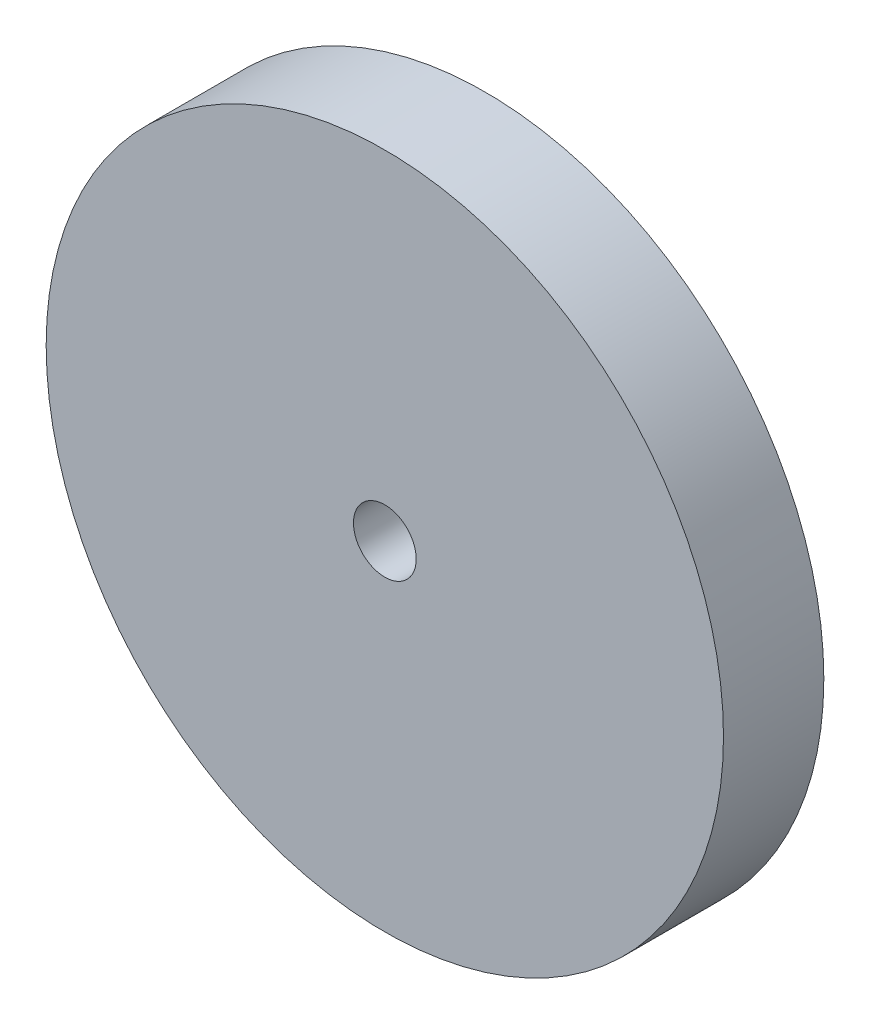
ISO-10303-21;
HEADER;
FILE_DESCRIPTION(('STEP AP214'),'2;1');
FILE_NAME('part.step','',(''),(''),'','','');
FILE_SCHEMA(('AUTOMOTIVE_DESIGN { 1 0 10303 214 1 1 1 1 }'));
ENDSEC;
DATA;
#1=APPLICATION_CONTEXT('core data for automotive mechanical design processes');
#2=APPLICATION_PROTOCOL_DEFINITION('international standard','automotive_design',2000,#1);
#3=PRODUCT_CONTEXT('',#1,'mechanical');
#4=PRODUCT('Part','Part','',(#3));
#5=PRODUCT_RELATED_PRODUCT_CATEGORY('part','',(#4));
#6=PRODUCT_DEFINITION_FORMATION('','',#4);
#7=PRODUCT_DEFINITION_CONTEXT('part definition',#1,'design');
#8=PRODUCT_DEFINITION('design','',#6,#7);
#9=PRODUCT_DEFINITION_SHAPE('','',#8);
#10=(LENGTH_UNIT() NAMED_UNIT(*) SI_UNIT(.MILLI.,.METRE.));
#11=(NAMED_UNIT(*) PLANE_ANGLE_UNIT() SI_UNIT($,.RADIAN.));
#12=(NAMED_UNIT(*) SI_UNIT($,.STERADIAN.) SOLID_ANGLE_UNIT());
#13=UNCERTAINTY_MEASURE_WITH_UNIT(LENGTH_MEASURE(1.E-05),#10,'distance_accuracy_value','');
#14=(GEOMETRIC_REPRESENTATION_CONTEXT(3) GLOBAL_UNCERTAINTY_ASSIGNED_CONTEXT((#13)) GLOBAL_UNIT_ASSIGNED_CONTEXT((#10,
#11,#12)) REPRESENTATION_CONTEXT('',''));
#15=CARTESIAN_POINT('',(0.,0.,0.));
#16=DIRECTION('',(0.,0.,1.));
#17=DIRECTION('',(1.,0.,0.));
#18=AXIS2_PLACEMENT_3D('',#15,#16,#17);
#19=CARTESIAN_POINT('',(0.,0.,8.));
#20=DIRECTION('',(0.,0.,1.));
#21=DIRECTION('',(1.,0.,0.));
#22=AXIS2_PLACEMENT_3D('',#19,#20,#21);
#23=PLANE('',#22);
#24=CARTESIAN_POINT('',(0.,0.,8.));
#25=DIRECTION('',(0.,0.,1.));
#26=DIRECTION('',(1.,0.,0.));
#27=AXIS2_PLACEMENT_3D('',#24,#25,#26);
#28=CIRCLE('',#27,27.);
#29=CARTESIAN_POINT('',(27.,0.,8.));
#30=VERTEX_POINT('',#29);
#31=EDGE_CURVE('E10',#30,#30,#28,.T.);
#32=ORIENTED_EDGE('',*,*,#31,.T.);
#33=EDGE_LOOP('',(#32));
#34=FACE_BOUND('',#33,.T.);
#35=CARTESIAN_POINT('',(0.,0.,8.));
#36=DIRECTION('',(0.,0.,1.));
#37=DIRECTION('',(1.,0.,0.));
#38=AXIS2_PLACEMENT_3D('',#35,#36,#37);
#39=CIRCLE('',#38,2.5);
#40=CARTESIAN_POINT('',(2.5,0.,8.));
#41=VERTEX_POINT('',#40);
#42=EDGE_CURVE('E50',#41,#41,#39,.T.);
#43=ORIENTED_EDGE('',*,*,#42,.F.);
#44=EDGE_LOOP('',(#43));
#45=FACE_BOUND('',#44,.T.);
#46=ADVANCED_FACE('F37',(#34,#45),#23,.T.);
#47=CARTESIAN_POINT('',(0.,0.,0.));
#48=DIRECTION('',(0.,0.,1.));
#49=DIRECTION('',(1.,0.,0.));
#50=AXIS2_PLACEMENT_3D('',#47,#48,#49);
#51=PLANE('',#50);
#52=CARTESIAN_POINT('',(0.,0.,0.));
#53=DIRECTION('',(0.,0.,1.));
#54=DIRECTION('',(1.,0.,0.));
#55=AXIS2_PLACEMENT_3D('',#52,#53,#54);
#56=CIRCLE('',#55,27.);
#57=CARTESIAN_POINT('',(27.,0.,0.));
#58=VERTEX_POINT('',#57);
#59=EDGE_CURVE('E41',#58,#58,#56,.T.);
#60=ORIENTED_EDGE('',*,*,#59,.F.);
#61=EDGE_LOOP('',(#60));
#62=FACE_BOUND('',#61,.T.);
#63=CARTESIAN_POINT('',(0.,0.,0.));
#64=DIRECTION('',(0.,0.,1.));
#65=DIRECTION('',(1.,0.,0.));
#66=AXIS2_PLACEMENT_3D('',#63,#64,#65);
#67=CIRCLE('',#66,2.5);
#68=CARTESIAN_POINT('',(2.5,0.,0.));
#69=VERTEX_POINT('',#68);
#70=EDGE_CURVE('E52',#69,#69,#67,.T.);
#71=ORIENTED_EDGE('',*,*,#70,.T.);
#72=EDGE_LOOP('',(#71));
#73=FACE_BOUND('',#72,.T.);
#74=ADVANCED_FACE('F64',(#62,#73),#51,.F.);
#75=CARTESIAN_POINT('',(0.,0.,8.));
#76=DIRECTION('',(0.,0.,-1.));
#77=DIRECTION('',(-1.,0.,0.));
#78=AXIS2_PLACEMENT_3D('',#75,#76,#77);
#79=CYLINDRICAL_SURFACE('',#78,27.);
#80=ORIENTED_EDGE('',*,*,#31,.F.);
#81=EDGE_LOOP('',(#80));
#82=FACE_BOUND('',#81,.T.);
#83=ORIENTED_EDGE('',*,*,#59,.T.);
#84=EDGE_LOOP('',(#83));
#85=FACE_BOUND('',#84,.T.);
#86=ADVANCED_FACE('F39',(#82,#85),#79,.T.);
#87=CARTESIAN_POINT('',(0.,0.,8.));
#88=DIRECTION('',(0.,0.,-1.));
#89=DIRECTION('',(-1.,0.,0.));
#90=AXIS2_PLACEMENT_3D('',#87,#88,#89);
#91=CYLINDRICAL_SURFACE('',#90,2.5);
#92=ORIENTED_EDGE('',*,*,#42,.T.);
#93=EDGE_LOOP('',(#92));
#94=FACE_BOUND('',#93,.T.);
#95=ORIENTED_EDGE('',*,*,#70,.F.);
#96=EDGE_LOOP('',(#95));
#97=FACE_BOUND('',#96,.T.);
#98=ADVANCED_FACE('F60',(#94,#97),#91,.F.);
#99=CLOSED_SHELL('',(#46,#74,#86,#98));
#100=MANIFOLD_SOLID_BREP('B2',#99);
#101=ADVANCED_BREP_SHAPE_REPRESENTATION('',(#18,#100),#14);
#102=SHAPE_DEFINITION_REPRESENTATION(#9,#101);
ENDSEC;
END-ISO-10303-21;
